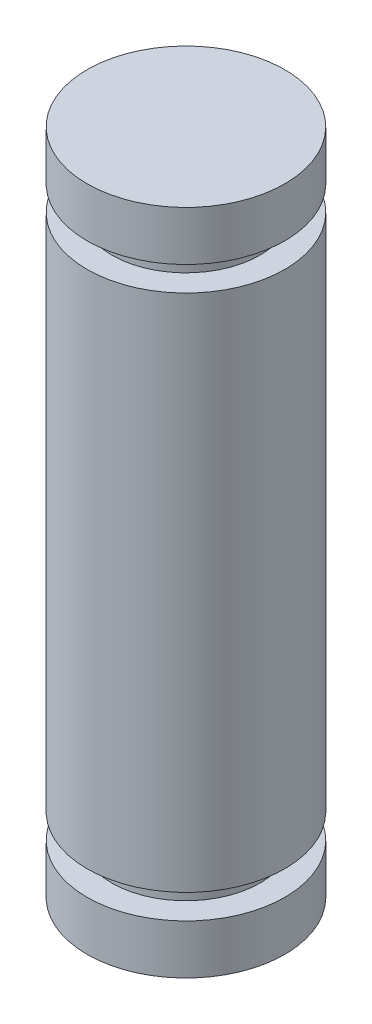
ISO-10303-21;
HEADER;
FILE_DESCRIPTION(('STEP AP214'),'2;1');
FILE_NAME('part.step','',(''),(''),'','','');
FILE_SCHEMA(('AUTOMOTIVE_DESIGN { 1 0 10303 214 1 1 1 1 }'));
ENDSEC;
DATA;
#1=APPLICATION_CONTEXT('core data for automotive mechanical design processes');
#2=APPLICATION_PROTOCOL_DEFINITION('international standard','automotive_design',2000,#1);
#3=PRODUCT_CONTEXT('',#1,'mechanical');
#4=PRODUCT('Part','Part','',(#3));
#5=PRODUCT_RELATED_PRODUCT_CATEGORY('part','',(#4));
#6=PRODUCT_DEFINITION_FORMATION('','',#4);
#7=PRODUCT_DEFINITION_CONTEXT('part definition',#1,'design');
#8=PRODUCT_DEFINITION('design','',#6,#7);
#9=PRODUCT_DEFINITION_SHAPE('','',#8);
#10=(LENGTH_UNIT() NAMED_UNIT(*) SI_UNIT(.MILLI.,.METRE.));
#11=(NAMED_UNIT(*) PLANE_ANGLE_UNIT() SI_UNIT($,.RADIAN.));
#12=(NAMED_UNIT(*) SI_UNIT($,.STERADIAN.) SOLID_ANGLE_UNIT());
#13=UNCERTAINTY_MEASURE_WITH_UNIT(LENGTH_MEASURE(1.E-05),#10,'distance_accuracy_value','');
#14=(GEOMETRIC_REPRESENTATION_CONTEXT(3) GLOBAL_UNCERTAINTY_ASSIGNED_CONTEXT((#13)) GLOBAL_UNIT_ASSIGNED_CONTEXT((#10,
#11,#12)) REPRESENTATION_CONTEXT('',''));
#15=CARTESIAN_POINT('',(0.,0.,0.));
#16=DIRECTION('',(0.,0.,1.));
#17=DIRECTION('',(1.,0.,0.));
#18=AXIS2_PLACEMENT_3D('',#15,#16,#17);
#19=CARTESIAN_POINT('',(0.,27.,0.));
#20=DIRECTION('',(0.,-1.,0.));
#21=DIRECTION('',(0.,0.,-1.));
#22=AXIS2_PLACEMENT_3D('',#19,#20,#21);
#23=CYLINDRICAL_SURFACE('',#22,4.);
#24=CARTESIAN_POINT('',(0.,3.,0.));
#25=DIRECTION('',(0.,1.,0.));
#26=DIRECTION('',(0.,0.,1.));
#27=AXIS2_PLACEMENT_3D('',#24,#25,#26);
#28=CIRCLE('',#27,4.);
#29=CARTESIAN_POINT('',(0.,3.,4.));
#30=VERTEX_POINT('',#29);
#31=EDGE_CURVE('E57',#30,#30,#28,.T.);
#32=ORIENTED_EDGE('',*,*,#31,.T.);
#33=EDGE_LOOP('',(#32));
#34=FACE_BOUND('',#33,.T.);
#35=CARTESIAN_POINT('',(0.,24.,0.));
#36=DIRECTION('',(0.,1.,0.));
#37=DIRECTION('',(0.,0.,1.));
#38=AXIS2_PLACEMENT_3D('',#35,#36,#37);
#39=CIRCLE('',#38,4.);
#40=CARTESIAN_POINT('',(0.,24.,4.));
#41=VERTEX_POINT('',#40);
#42=EDGE_CURVE('E43',#41,#41,#39,.T.);
#43=ORIENTED_EDGE('',*,*,#42,.F.);
#44=EDGE_LOOP('',(#43));
#45=FACE_BOUND('',#44,.T.);
#46=ADVANCED_FACE('F32',(#34,#45),#23,.T.);
#47=CARTESIAN_POINT('',(0.,24.,0.));
#48=DIRECTION('',(0.,1.,0.));
#49=DIRECTION('',(0.,0.,1.));
#50=AXIS2_PLACEMENT_3D('',#47,#48,#49);
#51=PLANE('',#50);
#52=CARTESIAN_POINT('',(0.,24.,0.));
#53=DIRECTION('',(0.,1.,0.));
#54=DIRECTION('',(0.,0.,1.));
#55=AXIS2_PLACEMENT_3D('',#52,#53,#54);
#56=CIRCLE('',#55,3.);
#57=CARTESIAN_POINT('',(0.,24.,3.));
#58=VERTEX_POINT('',#57);
#59=EDGE_CURVE('E48',#58,#58,#56,.T.);
#60=ORIENTED_EDGE('',*,*,#59,.F.);
#61=EDGE_LOOP('',(#60));
#62=FACE_BOUND('',#61,.T.);
#63=ORIENTED_EDGE('',*,*,#42,.T.);
#64=EDGE_LOOP('',(#63));
#65=FACE_BOUND('',#64,.T.);
#66=ADVANCED_FACE('F88',(#62,#65),#51,.T.);
#67=CARTESIAN_POINT('',(0.,25.,0.));
#68=DIRECTION('',(0.,1.,0.));
#69=DIRECTION('',(0.,0.,1.));
#70=AXIS2_PLACEMENT_3D('',#67,#68,#69);
#71=PLANE('',#70);
#72=CARTESIAN_POINT('',(0.,25.,0.));
#73=DIRECTION('',(0.,1.,0.));
#74=DIRECTION('',(0.,0.,1.));
#75=AXIS2_PLACEMENT_3D('',#72,#73,#74);
#76=CIRCLE('',#75,3.);
#77=CARTESIAN_POINT('',(0.,25.,3.));
#78=VERTEX_POINT('',#77);
#79=EDGE_CURVE('E51',#78,#78,#76,.T.);
#80=ORIENTED_EDGE('',*,*,#79,.T.);
#81=EDGE_LOOP('',(#80));
#82=FACE_BOUND('',#81,.T.);
#83=CARTESIAN_POINT('',(0.,25.,0.));
#84=DIRECTION('',(0.,1.,0.));
#85=DIRECTION('',(0.,0.,1.));
#86=AXIS2_PLACEMENT_3D('',#83,#84,#85);
#87=CIRCLE('',#86,4.);
#88=CARTESIAN_POINT('',(0.,25.,4.));
#89=VERTEX_POINT('',#88);
#90=EDGE_CURVE('E45',#89,#89,#87,.T.);
#91=ORIENTED_EDGE('',*,*,#90,.F.);
#92=EDGE_LOOP('',(#91));
#93=FACE_BOUND('',#92,.T.);
#94=ADVANCED_FACE('F101',(#82,#93),#71,.F.);
#95=CARTESIAN_POINT('',(0.,24.,0.));
#96=DIRECTION('',(0.,1.,0.));
#97=DIRECTION('',(0.,0.,1.));
#98=AXIS2_PLACEMENT_3D('',#95,#96,#97);
#99=CYLINDRICAL_SURFACE('',#98,3.);
#100=ORIENTED_EDGE('',*,*,#59,.T.);
#101=EDGE_LOOP('',(#100));
#102=FACE_BOUND('',#101,.T.);
#103=ORIENTED_EDGE('',*,*,#79,.F.);
#104=EDGE_LOOP('',(#103));
#105=FACE_BOUND('',#104,.T.);
#106=ADVANCED_FACE('F96',(#102,#105),#99,.T.);
#107=CARTESIAN_POINT('',(0.,27.,0.));
#108=DIRECTION('',(0.,1.,0.));
#109=DIRECTION('',(0.,0.,1.));
#110=AXIS2_PLACEMENT_3D('',#107,#108,#109);
#111=PLANE('',#110);
#112=CARTESIAN_POINT('',(0.,27.,0.));
#113=DIRECTION('',(0.,1.,0.));
#114=DIRECTION('',(0.,0.,1.));
#115=AXIS2_PLACEMENT_3D('',#112,#113,#114);
#116=CIRCLE('',#115,4.);
#117=CARTESIAN_POINT('',(0.,27.,4.));
#118=VERTEX_POINT('',#117);
#119=EDGE_CURVE('E10',#118,#118,#116,.T.);
#120=ORIENTED_EDGE('',*,*,#119,.T.);
#121=EDGE_LOOP('',(#120));
#122=FACE_BOUND('',#121,.T.);
#123=ADVANCED_FACE('F91',(#122),#111,.T.);
#124=ORIENTED_EDGE('',*,*,#90,.T.);
#125=EDGE_LOOP('',(#124));
#126=FACE_BOUND('',#125,.T.);
#127=ORIENTED_EDGE('',*,*,#119,.F.);
#128=EDGE_LOOP('',(#127));
#129=FACE_BOUND('',#128,.T.);
#130=ADVANCED_FACE('F34',(#126,#129),#23,.T.);
#131=CARTESIAN_POINT('',(0.,2.,0.));
#132=DIRECTION('',(0.,1.,0.));
#133=DIRECTION('',(0.,0.,1.));
#134=AXIS2_PLACEMENT_3D('',#131,#132,#133);
#135=PLANE('',#134);
#136=CARTESIAN_POINT('',(0.,2.,0.));
#137=DIRECTION('',(0.,1.,0.));
#138=DIRECTION('',(0.,0.,1.));
#139=AXIS2_PLACEMENT_3D('',#136,#137,#138);
#140=CIRCLE('',#139,3.);
#141=CARTESIAN_POINT('',(0.,2.,3.));
#142=VERTEX_POINT('',#141);
#143=EDGE_CURVE('E60',#142,#142,#140,.T.);
#144=ORIENTED_EDGE('',*,*,#143,.F.);
#145=EDGE_LOOP('',(#144));
#146=FACE_BOUND('',#145,.T.);
#147=CARTESIAN_POINT('',(0.,2.,0.));
#148=DIRECTION('',(0.,1.,0.));
#149=DIRECTION('',(0.,0.,1.));
#150=AXIS2_PLACEMENT_3D('',#147,#148,#149);
#151=CIRCLE('',#150,4.);
#152=CARTESIAN_POINT('',(0.,2.,4.));
#153=VERTEX_POINT('',#152);
#154=EDGE_CURVE('E54',#153,#153,#151,.T.);
#155=ORIENTED_EDGE('',*,*,#154,.T.);
#156=EDGE_LOOP('',(#155));
#157=FACE_BOUND('',#156,.T.);
#158=ADVANCED_FACE('F72',(#146,#157),#135,.T.);
#159=CARTESIAN_POINT('',(0.,3.,0.));
#160=DIRECTION('',(0.,1.,0.));
#161=DIRECTION('',(0.,0.,1.));
#162=AXIS2_PLACEMENT_3D('',#159,#160,#161);
#163=PLANE('',#162);
#164=CARTESIAN_POINT('',(0.,3.,0.));
#165=DIRECTION('',(0.,1.,0.));
#166=DIRECTION('',(0.,0.,1.));
#167=AXIS2_PLACEMENT_3D('',#164,#165,#166);
#168=CIRCLE('',#167,3.);
#169=CARTESIAN_POINT('',(0.,3.,3.));
#170=VERTEX_POINT('',#169);
#171=EDGE_CURVE('E63',#170,#170,#168,.T.);
#172=ORIENTED_EDGE('',*,*,#171,.T.);
#173=EDGE_LOOP('',(#172));
#174=FACE_BOUND('',#173,.T.);
#175=ORIENTED_EDGE('',*,*,#31,.F.);
#176=EDGE_LOOP('',(#175));
#177=FACE_BOUND('',#176,.T.);
#178=ADVANCED_FACE('F75',(#174,#177),#163,.F.);
#179=CARTESIAN_POINT('',(0.,2.,0.));
#180=DIRECTION('',(0.,1.,0.));
#181=DIRECTION('',(0.,0.,1.));
#182=AXIS2_PLACEMENT_3D('',#179,#180,#181);
#183=CYLINDRICAL_SURFACE('',#182,3.);
#184=ORIENTED_EDGE('',*,*,#143,.T.);
#185=EDGE_LOOP('',(#184));
#186=FACE_BOUND('',#185,.T.);
#187=ORIENTED_EDGE('',*,*,#171,.F.);
#188=EDGE_LOOP('',(#187));
#189=FACE_BOUND('',#188,.T.);
#190=ADVANCED_FACE('F69',(#186,#189),#183,.T.);
#191=CARTESIAN_POINT('',(0.,0.,0.));
#192=DIRECTION('',(0.,1.,0.));
#193=DIRECTION('',(0.,0.,1.));
#194=AXIS2_PLACEMENT_3D('',#191,#192,#193);
#195=PLANE('',#194);
#196=CARTESIAN_POINT('',(0.,0.,0.));
#197=DIRECTION('',(0.,1.,0.));
#198=DIRECTION('',(0.,0.,1.));
#199=AXIS2_PLACEMENT_3D('',#196,#197,#198);
#200=CIRCLE('',#199,4.);
#201=CARTESIAN_POINT('',(0.,0.,4.));
#202=VERTEX_POINT('',#201);
#203=EDGE_CURVE('E36',#202,#202,#200,.T.);
#204=ORIENTED_EDGE('',*,*,#203,.F.);
#205=EDGE_LOOP('',(#204));
#206=FACE_BOUND('',#205,.T.);
#207=ADVANCED_FACE('F81',(#206),#195,.F.);
#208=ORIENTED_EDGE('',*,*,#203,.T.);
#209=EDGE_LOOP('',(#208));
#210=FACE_BOUND('',#209,.T.);
#211=ORIENTED_EDGE('',*,*,#154,.F.);
#212=EDGE_LOOP('',(#211));
#213=FACE_BOUND('',#212,.T.);
#214=ADVANCED_FACE('F79',(#210,#213),#23,.T.);
#215=CLOSED_SHELL('',(#46,#66,#94,#106,#123,#130,#158,#178,#190,#207,#214));
#216=MANIFOLD_SOLID_BREP('B2',#215);
#217=ADVANCED_BREP_SHAPE_REPRESENTATION('',(#18,#216),#14);
#218=SHAPE_DEFINITION_REPRESENTATION(#9,#217);
ENDSEC;
END-ISO-10303-21;
